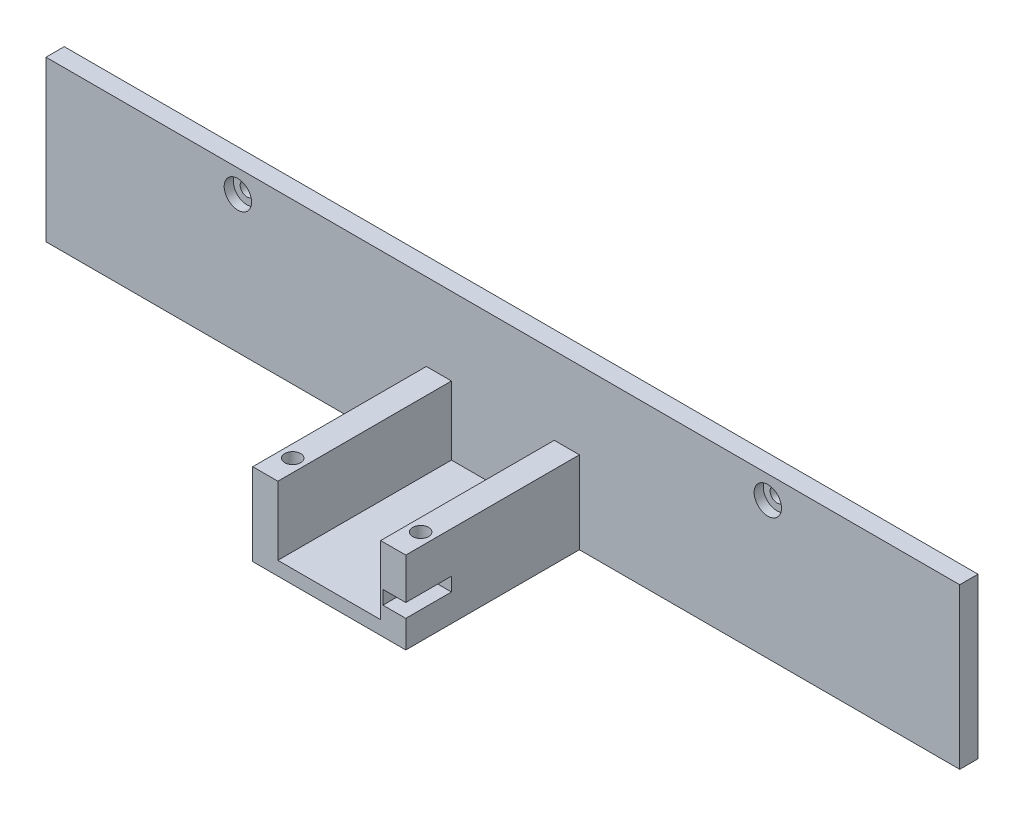
ISO-10303-21;
HEADER;
FILE_DESCRIPTION(('STEP AP214'),'2;1');
FILE_NAME('part.step','',(''),(''),'','','');
FILE_SCHEMA(('AUTOMOTIVE_DESIGN { 1 0 10303 214 1 1 1 1 }'));
ENDSEC;
DATA;
#1=APPLICATION_CONTEXT('core data for automotive mechanical design processes');
#2=APPLICATION_PROTOCOL_DEFINITION('international standard','automotive_design',2000,#1);
#3=PRODUCT_CONTEXT('',#1,'mechanical');
#4=PRODUCT('Part','Part','',(#3));
#5=PRODUCT_RELATED_PRODUCT_CATEGORY('part','',(#4));
#6=PRODUCT_DEFINITION_FORMATION('','',#4);
#7=PRODUCT_DEFINITION_CONTEXT('part definition',#1,'design');
#8=PRODUCT_DEFINITION('design','',#6,#7);
#9=PRODUCT_DEFINITION_SHAPE('','',#8);
#10=(LENGTH_UNIT() NAMED_UNIT(*) SI_UNIT(.MILLI.,.METRE.));
#11=(NAMED_UNIT(*) PLANE_ANGLE_UNIT() SI_UNIT($,.RADIAN.));
#12=(NAMED_UNIT(*) SI_UNIT($,.STERADIAN.) SOLID_ANGLE_UNIT());
#13=UNCERTAINTY_MEASURE_WITH_UNIT(LENGTH_MEASURE(1.E-05),#10,'distance_accuracy_value','');
#14=(GEOMETRIC_REPRESENTATION_CONTEXT(3) GLOBAL_UNCERTAINTY_ASSIGNED_CONTEXT((#13)) GLOBAL_UNIT_ASSIGNED_CONTEXT((#10,
#11,#12)) REPRESENTATION_CONTEXT('',''));
#15=CARTESIAN_POINT('',(0.,0.,0.));
#16=DIRECTION('',(0.,0.,1.));
#17=DIRECTION('',(1.,0.,0.));
#18=AXIS2_PLACEMENT_3D('',#15,#16,#17);
#19=CARTESIAN_POINT('',(0.,0.,4.));
#20=DIRECTION('',(0.,1.,0.));
#21=DIRECTION('',(0.,0.,1.));
#22=AXIS2_PLACEMENT_3D('',#19,#20,#21);
#23=PLANE('',#22);
#24=DIRECTION('',(1.,0.,0.));
#25=VECTOR('',#24,1.);
#26=CARTESIAN_POINT('',(0.,0.,0.));
#27=LINE('',#26,#25);
#28=CARTESIAN_POINT('',(0.,0.,0.));
#29=VERTEX_POINT('',#28);
#30=CARTESIAN_POINT('',(200.,0.,0.));
#31=VERTEX_POINT('',#30);
#32=EDGE_CURVE('E262',#29,#31,#27,.T.);
#33=ORIENTED_EDGE('',*,*,#32,.T.);
#34=DIRECTION('',(0.,0.,-1.));
#35=VECTOR('',#34,1.);
#36=CARTESIAN_POINT('',(200.,0.,4.));
#37=LINE('',#36,#35);
#38=CARTESIAN_POINT('',(200.,0.,4.));
#39=VERTEX_POINT('',#38);
#40=EDGE_CURVE('E46',#39,#31,#37,.T.);
#41=ORIENTED_EDGE('',*,*,#40,.F.);
#42=DIRECTION('',(1.,0.,0.));
#43=VECTOR('',#42,1.);
#44=CARTESIAN_POINT('',(0.,0.,4.));
#45=LINE('',#44,#43);
#46=CARTESIAN_POINT('',(116.75,0.,4.));
#47=VERTEX_POINT('',#46);
#48=EDGE_CURVE('E269',#47,#39,#45,.T.);
#49=ORIENTED_EDGE('',*,*,#48,.F.);
#50=DIRECTION('',(0.,0.,-1.));
#51=VECTOR('',#50,1.);
#52=CARTESIAN_POINT('',(116.75,0.,42.));
#53=LINE('',#52,#51);
#54=CARTESIAN_POINT('',(116.75,0.,42.));
#55=VERTEX_POINT('',#54);
#56=EDGE_CURVE('E61',#55,#47,#53,.T.);
#57=ORIENTED_EDGE('',*,*,#56,.F.);
#58=DIRECTION('',(1.,0.,0.));
#59=VECTOR('',#58,1.);
#60=CARTESIAN_POINT('',(0.,0.,42.));
#61=LINE('',#60,#59);
#62=CARTESIAN_POINT('',(83.25,0.,42.));
#63=VERTEX_POINT('',#62);
#64=EDGE_CURVE('E194',#63,#55,#61,.T.);
#65=ORIENTED_EDGE('',*,*,#64,.F.);
#66=DIRECTION('',(0.,0.,-1.));
#67=VECTOR('',#66,1.);
#68=CARTESIAN_POINT('',(83.25,0.,42.));
#69=LINE('',#68,#67);
#70=CARTESIAN_POINT('',(83.25,0.,4.));
#71=VERTEX_POINT('',#70);
#72=EDGE_CURVE('E247',#63,#71,#69,.T.);
#73=ORIENTED_EDGE('',*,*,#72,.T.);
#74=CARTESIAN_POINT('',(0.,0.,4.));
#75=VERTEX_POINT('',#74);
#76=EDGE_CURVE('E265',#75,#71,#45,.T.);
#77=ORIENTED_EDGE('',*,*,#76,.F.);
#78=DIRECTION('',(0.,0.,-1.));
#79=VECTOR('',#78,1.);
#80=CARTESIAN_POINT('',(0.,0.,4.));
#81=LINE('',#80,#79);
#82=EDGE_CURVE('E283',#75,#29,#81,.T.);
#83=ORIENTED_EDGE('',*,*,#82,.T.);
#84=EDGE_LOOP('',(#33,#41,#49,#57,#65,#73,#77,#83));
#85=FACE_BOUND('',#84,.T.);
#86=ADVANCED_FACE('F39',(#85),#23,.F.);
#87=CARTESIAN_POINT('',(200.,0.,4.));
#88=DIRECTION('',(-1.,0.,0.));
#89=DIRECTION('',(0.,0.,1.));
#90=AXIS2_PLACEMENT_3D('',#87,#88,#89);
#91=PLANE('',#90);
#92=DIRECTION('',(0.,1.,0.));
#93=VECTOR('',#92,1.);
#94=CARTESIAN_POINT('',(200.,0.,0.));
#95=LINE('',#94,#93);
#96=CARTESIAN_POINT('',(200.,35.,0.));
#97=VERTEX_POINT('',#96);
#98=EDGE_CURVE('E286',#31,#97,#95,.T.);
#99=ORIENTED_EDGE('',*,*,#98,.T.);
#100=DIRECTION('',(0.,0.,-1.));
#101=VECTOR('',#100,1.);
#102=CARTESIAN_POINT('',(200.,35.,4.));
#103=LINE('',#102,#101);
#104=CARTESIAN_POINT('',(200.,35.,4.));
#105=VERTEX_POINT('',#104);
#106=EDGE_CURVE('E298',#105,#97,#103,.T.);
#107=ORIENTED_EDGE('',*,*,#106,.F.);
#108=DIRECTION('',(0.,1.,0.));
#109=VECTOR('',#108,1.);
#110=CARTESIAN_POINT('',(200.,0.,4.));
#111=LINE('',#110,#109);
#112=EDGE_CURVE('E268',#39,#105,#111,.T.);
#113=ORIENTED_EDGE('',*,*,#112,.F.);
#114=ORIENTED_EDGE('',*,*,#40,.T.);
#115=EDGE_LOOP('',(#99,#107,#113,#114));
#116=FACE_BOUND('',#115,.T.);
#117=ADVANCED_FACE('F303',(#116),#91,.F.);
#118=CARTESIAN_POINT('',(0.,35.,4.));
#119=DIRECTION('',(0.,1.,0.));
#120=DIRECTION('',(-1.,0.,0.));
#121=AXIS2_PLACEMENT_3D('',#118,#119,#120);
#122=PLANE('',#121);
#123=DIRECTION('',(1.,0.,0.));
#124=VECTOR('',#123,1.);
#125=CARTESIAN_POINT('',(0.,35.,0.));
#126=LINE('',#125,#124);
#127=CARTESIAN_POINT('',(0.,35.,0.));
#128=VERTEX_POINT('',#127);
#129=EDGE_CURVE('E289',#128,#97,#126,.T.);
#130=ORIENTED_EDGE('',*,*,#129,.F.);
#131=DIRECTION('',(0.,0.,-1.));
#132=VECTOR('',#131,1.);
#133=CARTESIAN_POINT('',(0.,35.,4.));
#134=LINE('',#133,#132);
#135=CARTESIAN_POINT('',(0.,35.,4.));
#136=VERTEX_POINT('',#135);
#137=EDGE_CURVE('E296',#136,#128,#134,.T.);
#138=ORIENTED_EDGE('',*,*,#137,.F.);
#139=DIRECTION('',(1.,0.,0.));
#140=VECTOR('',#139,1.);
#141=CARTESIAN_POINT('',(0.,35.,4.));
#142=LINE('',#141,#140);
#143=EDGE_CURVE('E271',#136,#105,#142,.T.);
#144=ORIENTED_EDGE('',*,*,#143,.T.);
#145=ORIENTED_EDGE('',*,*,#106,.T.);
#146=EDGE_LOOP('',(#130,#138,#144,#145));
#147=FACE_BOUND('',#146,.T.);
#148=ADVANCED_FACE('F319',(#147),#122,.T.);
#149=CARTESIAN_POINT('',(42.,30.,4.));
#150=DIRECTION('',(0.,0.,-1.));
#151=DIRECTION('',(-1.,0.,0.));
#152=AXIS2_PLACEMENT_3D('',#149,#150,#151);
#153=CYLINDRICAL_SURFACE('',#152,2.99999999999999);
#154=CARTESIAN_POINT('',(42.,30.,2.));
#155=DIRECTION('',(0.,0.,1.));
#156=DIRECTION('',(1.,0.,0.));
#157=AXIS2_PLACEMENT_3D('',#154,#155,#156);
#158=CIRCLE('',#157,2.99999999999999);
#159=CARTESIAN_POINT('',(45.,30.,2.));
#160=VERTEX_POINT('',#159);
#161=EDGE_CURVE('E256',#160,#160,#158,.F.);
#162=ORIENTED_EDGE('',*,*,#161,.T.);
#163=EDGE_LOOP('',(#162));
#164=FACE_BOUND('',#163,.T.);
#165=CARTESIAN_POINT('',(42.,30.,4.));
#166=DIRECTION('',(0.,0.,1.));
#167=DIRECTION('',(1.,0.,0.));
#168=AXIS2_PLACEMENT_3D('',#165,#166,#167);
#169=CIRCLE('',#168,2.99999999999999);
#170=CARTESIAN_POINT('',(45.,30.,4.));
#171=VERTEX_POINT('',#170);
#172=EDGE_CURVE('E277',#171,#171,#169,.F.);
#173=ORIENTED_EDGE('',*,*,#172,.F.);
#174=EDGE_LOOP('',(#173));
#175=FACE_BOUND('',#174,.T.);
#176=ADVANCED_FACE('F373',(#164,#175),#153,.F.);
#177=CARTESIAN_POINT('',(0.,0.,4.));
#178=DIRECTION('',(-1.,0.,0.));
#179=DIRECTION('',(0.,0.,1.));
#180=AXIS2_PLACEMENT_3D('',#177,#178,#179);
#181=PLANE('',#180);
#182=DIRECTION('',(0.,1.,0.));
#183=VECTOR('',#182,1.);
#184=CARTESIAN_POINT('',(0.,0.,0.));
#185=LINE('',#184,#183);
#186=EDGE_CURVE('E292',#29,#128,#185,.T.);
#187=ORIENTED_EDGE('',*,*,#186,.F.);
#188=ORIENTED_EDGE('',*,*,#82,.F.);
#189=DIRECTION('',(0.,1.,0.));
#190=VECTOR('',#189,1.);
#191=CARTESIAN_POINT('',(0.,0.,4.));
#192=LINE('',#191,#190);
#193=EDGE_CURVE('E274',#75,#136,#192,.T.);
#194=ORIENTED_EDGE('',*,*,#193,.T.);
#195=ORIENTED_EDGE('',*,*,#137,.T.);
#196=EDGE_LOOP('',(#187,#188,#194,#195));
#197=FACE_BOUND('',#196,.T.);
#198=ADVANCED_FACE('F314',(#197),#181,.T.);
#199=CARTESIAN_POINT('',(158.,30.,4.));
#200=DIRECTION('',(0.,0.,-1.));
#201=DIRECTION('',(-1.,0.,0.));
#202=AXIS2_PLACEMENT_3D('',#199,#200,#201);
#203=CYLINDRICAL_SURFACE('',#202,2.99999999999999);
#204=CARTESIAN_POINT('',(158.,30.,2.));
#205=DIRECTION('',(0.,0.,1.));
#206=DIRECTION('',(1.,0.,0.));
#207=AXIS2_PLACEMENT_3D('',#204,#205,#206);
#208=CIRCLE('',#207,2.99999999999999);
#209=CARTESIAN_POINT('',(161.,30.,2.));
#210=VERTEX_POINT('',#209);
#211=EDGE_CURVE('E11',#210,#210,#208,.T.);
#212=ORIENTED_EDGE('',*,*,#211,.F.);
#213=EDGE_LOOP('',(#212));
#214=FACE_BOUND('',#213,.T.);
#215=CARTESIAN_POINT('',(158.,30.,4.));
#216=DIRECTION('',(0.,0.,1.));
#217=DIRECTION('',(1.,0.,0.));
#218=AXIS2_PLACEMENT_3D('',#215,#216,#217);
#219=CIRCLE('',#218,2.99999999999999);
#220=CARTESIAN_POINT('',(161.,30.,4.));
#221=VERTEX_POINT('',#220);
#222=EDGE_CURVE('E280',#221,#221,#219,.T.);
#223=ORIENTED_EDGE('',*,*,#222,.T.);
#224=EDGE_LOOP('',(#223));
#225=FACE_BOUND('',#224,.T.);
#226=ADVANCED_FACE('F378',(#214,#225),#203,.F.);
#227=CARTESIAN_POINT('',(0.,0.,4.));
#228=DIRECTION('',(0.,0.,1.));
#229=DIRECTION('',(1.,0.,0.));
#230=AXIS2_PLACEMENT_3D('',#227,#228,#229);
#231=PLANE('',#230);
#232=DIRECTION('',(0.,-1.,0.));
#233=VECTOR('',#232,1.);
#234=CARTESIAN_POINT('',(83.25,0.,4.));
#235=LINE('',#234,#233);
#236=CARTESIAN_POINT('',(83.25,18.,4.));
#237=VERTEX_POINT('',#236);
#238=EDGE_CURVE('E187',#237,#71,#235,.T.);
#239=ORIENTED_EDGE('',*,*,#238,.F.);
#240=DIRECTION('',(1.,0.,0.));
#241=VECTOR('',#240,1.);
#242=CARTESIAN_POINT('',(0.,18.,4.));
#243=LINE('',#242,#241);
#244=CARTESIAN_POINT('',(88.75,18.,4.));
#245=VERTEX_POINT('',#244);
#246=EDGE_CURVE('E195',#237,#245,#243,.T.);
#247=ORIENTED_EDGE('',*,*,#246,.T.);
#248=DIRECTION('',(0.,-1.,0.));
#249=VECTOR('',#248,1.);
#250=CARTESIAN_POINT('',(88.75,0.,4.));
#251=LINE('',#250,#249);
#252=CARTESIAN_POINT('',(88.75,3.,4.));
#253=VERTEX_POINT('',#252);
#254=EDGE_CURVE('E230',#245,#253,#251,.T.);
#255=ORIENTED_EDGE('',*,*,#254,.T.);
#256=DIRECTION('',(1.,0.,0.));
#257=VECTOR('',#256,1.);
#258=CARTESIAN_POINT('',(0.,2.99999999999999,4.));
#259=LINE('',#258,#257);
#260=CARTESIAN_POINT('',(111.25,3.,4.));
#261=VERTEX_POINT('',#260);
#262=EDGE_CURVE('E227',#253,#261,#259,.T.);
#263=ORIENTED_EDGE('',*,*,#262,.T.);
#264=DIRECTION('',(0.,-1.,0.));
#265=VECTOR('',#264,1.);
#266=CARTESIAN_POINT('',(111.25,0.,4.));
#267=LINE('',#266,#265);
#268=CARTESIAN_POINT('',(111.25,18.,4.));
#269=VERTEX_POINT('',#268);
#270=EDGE_CURVE('E224',#269,#261,#267,.T.);
#271=ORIENTED_EDGE('',*,*,#270,.F.);
#272=DIRECTION('',(1.,0.,0.));
#273=VECTOR('',#272,1.);
#274=CARTESIAN_POINT('',(0.,18.,4.));
#275=LINE('',#274,#273);
#276=CARTESIAN_POINT('',(116.75,18.,4.));
#277=VERTEX_POINT('',#276);
#278=EDGE_CURVE('E221',#269,#277,#275,.T.);
#279=ORIENTED_EDGE('',*,*,#278,.T.);
#280=DIRECTION('',(0.,-1.,0.));
#281=VECTOR('',#280,1.);
#282=CARTESIAN_POINT('',(116.75,0.,4.));
#283=LINE('',#282,#281);
#284=EDGE_CURVE('E219',#277,#47,#283,.T.);
#285=ORIENTED_EDGE('',*,*,#284,.T.);
#286=ORIENTED_EDGE('',*,*,#48,.T.);
#287=ORIENTED_EDGE('',*,*,#112,.T.);
#288=ORIENTED_EDGE('',*,*,#143,.F.);
#289=ORIENTED_EDGE('',*,*,#193,.F.);
#290=ORIENTED_EDGE('',*,*,#76,.T.);
#291=EDGE_LOOP('',(#239,#247,#255,#263,#271,#279,#285,#286,#287,#288,#289,#290));
#292=FACE_BOUND('',#291,.T.);
#293=ORIENTED_EDGE('',*,*,#172,.T.);
#294=EDGE_LOOP('',(#293));
#295=FACE_BOUND('',#294,.T.);
#296=ORIENTED_EDGE('',*,*,#222,.F.);
#297=EDGE_LOOP('',(#296));
#298=FACE_BOUND('',#297,.T.);
#299=ADVANCED_FACE('F322',(#292,#295,#298),#231,.T.);
#300=CARTESIAN_POINT('',(0.,0.,0.));
#301=DIRECTION('',(0.,0.,1.));
#302=DIRECTION('',(1.,0.,0.));
#303=AXIS2_PLACEMENT_3D('',#300,#301,#302);
#304=PLANE('',#303);
#305=ORIENTED_EDGE('',*,*,#32,.F.);
#306=ORIENTED_EDGE('',*,*,#186,.T.);
#307=ORIENTED_EDGE('',*,*,#129,.T.);
#308=ORIENTED_EDGE('',*,*,#98,.F.);
#309=EDGE_LOOP('',(#305,#306,#307,#308));
#310=FACE_BOUND('',#309,.T.);
#311=CARTESIAN_POINT('',(42.,30.,0.));
#312=DIRECTION('',(0.,0.,1.));
#313=DIRECTION('',(1.,0.,0.));
#314=AXIS2_PLACEMENT_3D('',#311,#312,#313);
#315=CIRCLE('',#314,1.5);
#316=CARTESIAN_POINT('',(43.5,30.,0.));
#317=VERTEX_POINT('',#316);
#318=EDGE_CURVE('E253',#317,#317,#315,.F.);
#319=ORIENTED_EDGE('',*,*,#318,.F.);
#320=EDGE_LOOP('',(#319));
#321=FACE_BOUND('',#320,.T.);
#322=CARTESIAN_POINT('',(158.,30.,0.));
#323=DIRECTION('',(0.,0.,1.));
#324=DIRECTION('',(1.,0.,0.));
#325=AXIS2_PLACEMENT_3D('',#322,#323,#324);
#326=CIRCLE('',#325,1.5);
#327=CARTESIAN_POINT('',(159.5,30.,0.));
#328=VERTEX_POINT('',#327);
#329=EDGE_CURVE('E249',#328,#328,#326,.T.);
#330=ORIENTED_EDGE('',*,*,#329,.T.);
#331=EDGE_LOOP('',(#330));
#332=FACE_BOUND('',#331,.T.);
#333=ADVANCED_FACE('F311',(#310,#321,#332),#304,.F.);
#334=CARTESIAN_POINT('',(42.,30.,2.));
#335=DIRECTION('',(0.,0.,-1.));
#336=DIRECTION('',(-1.,0.,0.));
#337=AXIS2_PLACEMENT_3D('',#334,#335,#336);
#338=CYLINDRICAL_SURFACE('',#337,1.5);
#339=CARTESIAN_POINT('',(42.,30.,2.));
#340=DIRECTION('',(0.,0.,1.));
#341=DIRECTION('',(1.,0.,0.));
#342=AXIS2_PLACEMENT_3D('',#339,#340,#341);
#343=CIRCLE('',#342,1.5);
#344=CARTESIAN_POINT('',(43.5,30.,2.));
#345=VERTEX_POINT('',#344);
#346=EDGE_CURVE('E259',#345,#345,#343,.F.);
#347=ORIENTED_EDGE('',*,*,#346,.F.);
#348=EDGE_LOOP('',(#347));
#349=FACE_BOUND('',#348,.T.);
#350=ORIENTED_EDGE('',*,*,#318,.T.);
#351=EDGE_LOOP('',(#350));
#352=FACE_BOUND('',#351,.T.);
#353=ADVANCED_FACE('F387',(#349,#352),#338,.F.);
#354=CARTESIAN_POINT('',(0.,0.,2.));
#355=DIRECTION('',(0.,0.,1.));
#356=DIRECTION('',(1.,0.,0.));
#357=AXIS2_PLACEMENT_3D('',#354,#355,#356);
#358=PLANE('',#357);
#359=ORIENTED_EDGE('',*,*,#161,.F.);
#360=EDGE_LOOP('',(#359));
#361=FACE_BOUND('',#360,.T.);
#362=ORIENTED_EDGE('',*,*,#346,.T.);
#363=EDGE_LOOP('',(#362));
#364=FACE_BOUND('',#363,.T.);
#365=ADVANCED_FACE('F392',(#361,#364),#358,.T.);
#366=CARTESIAN_POINT('',(158.,30.,2.));
#367=DIRECTION('',(0.,0.,-1.));
#368=DIRECTION('',(-1.,0.,0.));
#369=AXIS2_PLACEMENT_3D('',#366,#367,#368);
#370=CYLINDRICAL_SURFACE('',#369,1.5);
#371=CARTESIAN_POINT('',(158.,30.,2.));
#372=DIRECTION('',(0.,0.,1.));
#373=DIRECTION('',(1.,0.,0.));
#374=AXIS2_PLACEMENT_3D('',#371,#372,#373);
#375=CIRCLE('',#374,1.5);
#376=CARTESIAN_POINT('',(159.5,30.,2.));
#377=VERTEX_POINT('',#376);
#378=EDGE_CURVE('E250',#377,#377,#375,.T.);
#379=ORIENTED_EDGE('',*,*,#378,.T.);
#380=EDGE_LOOP('',(#379));
#381=FACE_BOUND('',#380,.T.);
#382=ORIENTED_EDGE('',*,*,#329,.F.);
#383=EDGE_LOOP('',(#382));
#384=FACE_BOUND('',#383,.T.);
#385=ADVANCED_FACE('F396',(#381,#384),#370,.F.);
#386=CARTESIAN_POINT('',(0.,0.,2.));
#387=DIRECTION('',(0.,0.,1.));
#388=DIRECTION('',(1.,0.,0.));
#389=AXIS2_PLACEMENT_3D('',#386,#387,#388);
#390=PLANE('',#389);
#391=ORIENTED_EDGE('',*,*,#378,.F.);
#392=EDGE_LOOP('',(#391));
#393=FACE_BOUND('',#392,.T.);
#394=ORIENTED_EDGE('',*,*,#211,.T.);
#395=EDGE_LOOP('',(#394));
#396=FACE_BOUND('',#395,.T.);
#397=ADVANCED_FACE('F364',(#393,#396),#390,.T.);
#398=CARTESIAN_POINT('',(83.25,0.,42.));
#399=DIRECTION('',(1.,0.,0.));
#400=DIRECTION('',(0.,0.,-1.));
#401=AXIS2_PLACEMENT_3D('',#398,#399,#400);
#402=PLANE('',#401);
#403=ORIENTED_EDGE('',*,*,#238,.T.);
#404=ORIENTED_EDGE('',*,*,#72,.F.);
#405=DIRECTION('',(0.,-1.,0.));
#406=VECTOR('',#405,1.);
#407=CARTESIAN_POINT('',(83.25,0.,42.));
#408=LINE('',#407,#406);
#409=CARTESIAN_POINT('',(83.25,18.,42.));
#410=VERTEX_POINT('',#409);
#411=EDGE_CURVE('E191',#410,#63,#408,.T.);
#412=ORIENTED_EDGE('',*,*,#411,.F.);
#413=DIRECTION('',(0.,0.,-1.));
#414=VECTOR('',#413,1.);
#415=CARTESIAN_POINT('',(83.25,18.,42.));
#416=LINE('',#415,#414);
#417=EDGE_CURVE('E216',#410,#237,#416,.T.);
#418=ORIENTED_EDGE('',*,*,#417,.T.);
#419=EDGE_LOOP('',(#403,#404,#412,#418));
#420=FACE_BOUND('',#419,.T.);
#421=ADVANCED_FACE('F333',(#420),#402,.F.);
#422=CARTESIAN_POINT('',(116.75,0.,42.));
#423=DIRECTION('',(1.,0.,0.));
#424=DIRECTION('',(0.,1.,0.));
#425=AXIS2_PLACEMENT_3D('',#422,#423,#424);
#426=PLANE('',#425);
#427=DIRECTION('',(0.,0.,1.));
#428=VECTOR('',#427,1.);
#429=CARTESIAN_POINT('',(116.75,9.,32.));
#430=LINE('',#429,#428);
#431=CARTESIAN_POINT('',(116.75,9.,32.));
#432=VERTEX_POINT('',#431);
#433=CARTESIAN_POINT('',(116.75,9.,42.));
#434=VERTEX_POINT('',#433);
#435=EDGE_CURVE('E188',#432,#434,#430,.T.);
#436=ORIENTED_EDGE('',*,*,#435,.F.);
#437=DIRECTION('',(0.,1.,0.));
#438=VECTOR('',#437,1.);
#439=CARTESIAN_POINT('',(116.75,6.,32.));
#440=LINE('',#439,#438);
#441=CARTESIAN_POINT('',(116.75,6.,32.));
#442=VERTEX_POINT('',#441);
#443=EDGE_CURVE('E167',#442,#432,#440,.T.);
#444=ORIENTED_EDGE('',*,*,#443,.F.);
#445=DIRECTION('',(0.,0.,1.));
#446=VECTOR('',#445,1.);
#447=CARTESIAN_POINT('',(116.75,6.,32.));
#448=LINE('',#447,#446);
#449=CARTESIAN_POINT('',(116.75,6.,42.));
#450=VERTEX_POINT('',#449);
#451=EDGE_CURVE('E158',#442,#450,#448,.T.);
#452=ORIENTED_EDGE('',*,*,#451,.T.);
#453=DIRECTION('',(0.,-1.,0.));
#454=VECTOR('',#453,1.);
#455=CARTESIAN_POINT('',(116.75,0.,42.));
#456=LINE('',#455,#454);
#457=EDGE_CURVE('E198',#450,#55,#456,.T.);
#458=ORIENTED_EDGE('',*,*,#457,.T.);
#459=ORIENTED_EDGE('',*,*,#56,.T.);
#460=ORIENTED_EDGE('',*,*,#284,.F.);
#461=DIRECTION('',(0.,0.,-1.));
#462=VECTOR('',#461,1.);
#463=CARTESIAN_POINT('',(116.75,18.,42.));
#464=LINE('',#463,#462);
#465=CARTESIAN_POINT('',(116.75,18.,42.));
#466=VERTEX_POINT('',#465);
#467=EDGE_CURVE('E244',#466,#277,#464,.T.);
#468=ORIENTED_EDGE('',*,*,#467,.F.);
#469=EDGE_CURVE('E199',#466,#434,#456,.T.);
#470=ORIENTED_EDGE('',*,*,#469,.T.);
#471=EDGE_LOOP('',(#436,#444,#452,#458,#459,#460,#468,#470));
#472=FACE_BOUND('',#471,.T.);
#473=ADVANCED_FACE('F355',(#472),#426,.T.);
#474=CARTESIAN_POINT('',(0.,18.,42.));
#475=DIRECTION('',(0.,1.,0.));
#476=DIRECTION('',(-1.,0.,0.));
#477=AXIS2_PLACEMENT_3D('',#474,#475,#476);
#478=PLANE('',#477);
#479=CARTESIAN_POINT('',(114.,18.,36.));
#480=DIRECTION('',(0.,1.,0.));
#481=DIRECTION('',(1.,0.,0.));
#482=AXIS2_PLACEMENT_3D('',#479,#480,#481);
#483=CIRCLE('',#482,1.75);
#484=CARTESIAN_POINT('',(115.75,18.,36.));
#485=VERTEX_POINT('',#484);
#486=EDGE_CURVE('E723',#485,#485,#483,.T.);
#487=ORIENTED_EDGE('',*,*,#486,.F.);
#488=EDGE_LOOP('',(#487));
#489=FACE_BOUND('',#488,.T.);
#490=ORIENTED_EDGE('',*,*,#278,.F.);
#491=DIRECTION('',(0.,0.,-1.));
#492=VECTOR('',#491,1.);
#493=CARTESIAN_POINT('',(111.25,18.,42.));
#494=LINE('',#493,#492);
#495=CARTESIAN_POINT('',(111.25,18.,42.));
#496=VERTEX_POINT('',#495);
#497=EDGE_CURVE('E242',#496,#269,#494,.T.);
#498=ORIENTED_EDGE('',*,*,#497,.F.);
#499=DIRECTION('',(1.,0.,0.));
#500=VECTOR('',#499,1.);
#501=CARTESIAN_POINT('',(0.,18.,42.));
#502=LINE('',#501,#500);
#503=EDGE_CURVE('E202',#496,#466,#502,.T.);
#504=ORIENTED_EDGE('',*,*,#503,.T.);
#505=ORIENTED_EDGE('',*,*,#467,.T.);
#506=EDGE_LOOP('',(#490,#498,#504,#505));
#507=FACE_BOUND('',#506,.T.);
#508=ADVANCED_FACE('F352',(#489,#507),#478,.T.);
#509=CARTESIAN_POINT('',(111.25,0.,42.));
#510=DIRECTION('',(1.,0.,0.));
#511=DIRECTION('',(0.,0.,-1.));
#512=AXIS2_PLACEMENT_3D('',#509,#510,#511);
#513=PLANE('',#512);
#514=ORIENTED_EDGE('',*,*,#270,.T.);
#515=DIRECTION('',(0.,0.,-1.));
#516=VECTOR('',#515,1.);
#517=CARTESIAN_POINT('',(111.25,3.,42.));
#518=LINE('',#517,#516);
#519=CARTESIAN_POINT('',(111.25,3.,42.));
#520=VERTEX_POINT('',#519);
#521=EDGE_CURVE('E240',#520,#261,#518,.T.);
#522=ORIENTED_EDGE('',*,*,#521,.F.);
#523=DIRECTION('',(0.,-1.,0.));
#524=VECTOR('',#523,1.);
#525=CARTESIAN_POINT('',(111.25,0.,42.));
#526=LINE('',#525,#524);
#527=EDGE_CURVE('E205',#496,#520,#526,.T.);
#528=ORIENTED_EDGE('',*,*,#527,.F.);
#529=ORIENTED_EDGE('',*,*,#497,.T.);
#530=EDGE_LOOP('',(#514,#522,#528,#529));
#531=FACE_BOUND('',#530,.T.);
#532=ADVANCED_FACE('F348',(#531),#513,.F.);
#533=CARTESIAN_POINT('',(0.,2.99999999999999,42.));
#534=DIRECTION('',(0.,1.,0.));
#535=DIRECTION('',(-1.,0.,0.));
#536=AXIS2_PLACEMENT_3D('',#533,#534,#535);
#537=PLANE('',#536);
#538=ORIENTED_EDGE('',*,*,#262,.F.);
#539=DIRECTION('',(0.,0.,-1.));
#540=VECTOR('',#539,1.);
#541=CARTESIAN_POINT('',(88.75,3.,42.));
#542=LINE('',#541,#540);
#543=CARTESIAN_POINT('',(88.75,3.,42.));
#544=VERTEX_POINT('',#543);
#545=EDGE_CURVE('E238',#544,#253,#542,.T.);
#546=ORIENTED_EDGE('',*,*,#545,.F.);
#547=DIRECTION('',(1.,0.,0.));
#548=VECTOR('',#547,1.);
#549=CARTESIAN_POINT('',(0.,2.99999999999999,42.));
#550=LINE('',#549,#548);
#551=EDGE_CURVE('E207',#544,#520,#550,.T.);
#552=ORIENTED_EDGE('',*,*,#551,.T.);
#553=ORIENTED_EDGE('',*,*,#521,.T.);
#554=EDGE_LOOP('',(#538,#546,#552,#553));
#555=FACE_BOUND('',#554,.T.);
#556=ADVANCED_FACE('F343',(#555),#537,.T.);
#557=CARTESIAN_POINT('',(88.75,0.,42.));
#558=DIRECTION('',(1.,0.,0.));
#559=DIRECTION('',(0.,0.,-1.));
#560=AXIS2_PLACEMENT_3D('',#557,#558,#559);
#561=PLANE('',#560);
#562=ORIENTED_EDGE('',*,*,#254,.F.);
#563=DIRECTION('',(0.,0.,-1.));
#564=VECTOR('',#563,1.);
#565=CARTESIAN_POINT('',(88.75,18.,42.));
#566=LINE('',#565,#564);
#567=CARTESIAN_POINT('',(88.75,18.,42.));
#568=VERTEX_POINT('',#567);
#569=EDGE_CURVE('E236',#568,#245,#566,.T.);
#570=ORIENTED_EDGE('',*,*,#569,.F.);
#571=DIRECTION('',(0.,-1.,0.));
#572=VECTOR('',#571,1.);
#573=CARTESIAN_POINT('',(88.75,0.,42.));
#574=LINE('',#573,#572);
#575=EDGE_CURVE('E210',#568,#544,#574,.T.);
#576=ORIENTED_EDGE('',*,*,#575,.T.);
#577=ORIENTED_EDGE('',*,*,#545,.T.);
#578=EDGE_LOOP('',(#562,#570,#576,#577));
#579=FACE_BOUND('',#578,.T.);
#580=ADVANCED_FACE('F339',(#579),#561,.T.);
#581=CARTESIAN_POINT('',(0.,18.,42.));
#582=DIRECTION('',(0.,1.,0.));
#583=DIRECTION('',(-1.,0.,0.));
#584=AXIS2_PLACEMENT_3D('',#581,#582,#583);
#585=PLANE('',#584);
#586=CARTESIAN_POINT('',(86.,18.,36.));
#587=DIRECTION('',(0.,1.,0.));
#588=DIRECTION('',(-1.,0.,0.));
#589=AXIS2_PLACEMENT_3D('',#586,#587,#588);
#590=CIRCLE('',#589,1.75);
#591=CARTESIAN_POINT('',(84.25,18.,36.));
#592=VERTEX_POINT('',#591);
#593=EDGE_CURVE('E725',#592,#592,#590,.T.);
#594=ORIENTED_EDGE('',*,*,#593,.F.);
#595=EDGE_LOOP('',(#594));
#596=FACE_BOUND('',#595,.T.);
#597=ORIENTED_EDGE('',*,*,#246,.F.);
#598=ORIENTED_EDGE('',*,*,#417,.F.);
#599=DIRECTION('',(1.,0.,0.));
#600=VECTOR('',#599,1.);
#601=CARTESIAN_POINT('',(0.,18.,42.));
#602=LINE('',#601,#600);
#603=EDGE_CURVE('E213',#410,#568,#602,.T.);
#604=ORIENTED_EDGE('',*,*,#603,.T.);
#605=ORIENTED_EDGE('',*,*,#569,.T.);
#606=EDGE_LOOP('',(#597,#598,#604,#605));
#607=FACE_BOUND('',#606,.T.);
#608=ADVANCED_FACE('F337',(#596,#607),#585,.T.);
#609=CARTESIAN_POINT('',(0.,0.,42.));
#610=DIRECTION('',(0.,0.,1.));
#611=DIRECTION('',(1.,0.,0.));
#612=AXIS2_PLACEMENT_3D('',#609,#610,#611);
#613=PLANE('',#612);
#614=DIRECTION('',(-1.,0.,0.));
#615=VECTOR('',#614,1.);
#616=CARTESIAN_POINT('',(111.75,9.,42.));
#617=LINE('',#616,#615);
#618=CARTESIAN_POINT('',(111.75,9.,42.));
#619=VERTEX_POINT('',#618);
#620=EDGE_CURVE('E171',#434,#619,#617,.T.);
#621=ORIENTED_EDGE('',*,*,#620,.F.);
#622=ORIENTED_EDGE('',*,*,#469,.F.);
#623=ORIENTED_EDGE('',*,*,#503,.F.);
#624=ORIENTED_EDGE('',*,*,#527,.T.);
#625=ORIENTED_EDGE('',*,*,#551,.F.);
#626=ORIENTED_EDGE('',*,*,#575,.F.);
#627=ORIENTED_EDGE('',*,*,#603,.F.);
#628=ORIENTED_EDGE('',*,*,#411,.T.);
#629=ORIENTED_EDGE('',*,*,#64,.T.);
#630=ORIENTED_EDGE('',*,*,#457,.F.);
#631=DIRECTION('',(1.,0.,0.));
#632=VECTOR('',#631,1.);
#633=CARTESIAN_POINT('',(111.75,6.,42.));
#634=LINE('',#633,#632);
#635=CARTESIAN_POINT('',(111.75,6.,42.));
#636=VERTEX_POINT('',#635);
#637=EDGE_CURVE('E174',#636,#450,#634,.T.);
#638=ORIENTED_EDGE('',*,*,#637,.F.);
#639=DIRECTION('',(0.,-1.,0.));
#640=VECTOR('',#639,1.);
#641=CARTESIAN_POINT('',(111.75,6.,42.));
#642=LINE('',#641,#640);
#643=EDGE_CURVE('E53',#619,#636,#642,.T.);
#644=ORIENTED_EDGE('',*,*,#643,.F.);
#645=EDGE_LOOP('',(#621,#622,#623,#624,#625,#626,#627,#628,#629,#630,#638,#644));
#646=FACE_BOUND('',#645,.T.);
#647=ADVANCED_FACE('F330',(#646),#613,.T.);
#648=CARTESIAN_POINT('',(111.75,6.,32.));
#649=DIRECTION('',(-1.,0.,0.));
#650=DIRECTION('',(0.,-1.,0.));
#651=AXIS2_PLACEMENT_3D('',#648,#649,#650);
#652=PLANE('',#651);
#653=ORIENTED_EDGE('',*,*,#643,.T.);
#654=DIRECTION('',(0.,0.,1.));
#655=VECTOR('',#654,1.);
#656=CARTESIAN_POINT('',(111.75,6.,32.));
#657=LINE('',#656,#655);
#658=CARTESIAN_POINT('',(111.75,6.,32.));
#659=VERTEX_POINT('',#658);
#660=EDGE_CURVE('E150',#659,#636,#657,.T.);
#661=ORIENTED_EDGE('',*,*,#660,.F.);
#662=DIRECTION('',(0.,-1.,0.));
#663=VECTOR('',#662,1.);
#664=CARTESIAN_POINT('',(111.75,6.,32.));
#665=LINE('',#664,#663);
#666=CARTESIAN_POINT('',(111.75,9.,32.));
#667=VERTEX_POINT('',#666);
#668=EDGE_CURVE('E154',#667,#659,#665,.T.);
#669=ORIENTED_EDGE('',*,*,#668,.F.);
#670=DIRECTION('',(0.,0.,1.));
#671=VECTOR('',#670,1.);
#672=CARTESIAN_POINT('',(111.75,9.,32.));
#673=LINE('',#672,#671);
#674=EDGE_CURVE('E185',#667,#619,#673,.T.);
#675=ORIENTED_EDGE('',*,*,#674,.T.);
#676=EDGE_LOOP('',(#653,#661,#669,#675));
#677=FACE_BOUND('',#676,.T.);
#678=ADVANCED_FACE('F152',(#677),#652,.F.);
#679=CARTESIAN_POINT('',(111.75,9.,32.));
#680=DIRECTION('',(0.,1.,0.));
#681=DIRECTION('',(0.,0.,1.));
#682=AXIS2_PLACEMENT_3D('',#679,#680,#681);
#683=PLANE('',#682);
#684=ORIENTED_EDGE('',*,*,#620,.T.);
#685=ORIENTED_EDGE('',*,*,#674,.F.);
#686=DIRECTION('',(-1.,0.,0.));
#687=VECTOR('',#686,1.);
#688=CARTESIAN_POINT('',(111.75,9.,32.));
#689=LINE('',#688,#687);
#690=EDGE_CURVE('E159',#432,#667,#689,.T.);
#691=ORIENTED_EDGE('',*,*,#690,.F.);
#692=ORIENTED_EDGE('',*,*,#435,.T.);
#693=EDGE_LOOP('',(#684,#685,#691,#692));
#694=FACE_BOUND('',#693,.T.);
#695=ADVANCED_FACE('F478',(#694),#683,.F.);
#696=CARTESIAN_POINT('',(111.75,6.,32.));
#697=DIRECTION('',(0.,-1.,0.));
#698=DIRECTION('',(0.,0.,-1.));
#699=AXIS2_PLACEMENT_3D('',#696,#697,#698);
#700=PLANE('',#699);
#701=ORIENTED_EDGE('',*,*,#637,.T.);
#702=ORIENTED_EDGE('',*,*,#451,.F.);
#703=DIRECTION('',(1.,0.,0.));
#704=VECTOR('',#703,1.);
#705=CARTESIAN_POINT('',(111.75,6.,32.));
#706=LINE('',#705,#704);
#707=EDGE_CURVE('E162',#659,#442,#706,.T.);
#708=ORIENTED_EDGE('',*,*,#707,.F.);
#709=ORIENTED_EDGE('',*,*,#660,.T.);
#710=EDGE_LOOP('',(#701,#702,#708,#709));
#711=FACE_BOUND('',#710,.T.);
#712=ADVANCED_FACE('F163',(#711),#700,.F.);
#713=CARTESIAN_POINT('',(0.,0.,32.));
#714=DIRECTION('',(0.,0.,-1.));
#715=DIRECTION('',(-1.,0.,0.));
#716=AXIS2_PLACEMENT_3D('',#713,#714,#715);
#717=PLANE('',#716);
#718=ORIENTED_EDGE('',*,*,#668,.T.);
#719=ORIENTED_EDGE('',*,*,#707,.T.);
#720=ORIENTED_EDGE('',*,*,#443,.T.);
#721=ORIENTED_EDGE('',*,*,#690,.T.);
#722=EDGE_LOOP('',(#718,#719,#720,#721));
#723=FACE_BOUND('',#722,.T.);
#724=ADVANCED_FACE('F169',(#723),#717,.F.);
#725=CARTESIAN_POINT('',(86.,12.,36.));
#726=DIRECTION('',(0.,1.,0.));
#727=DIRECTION('',(-1.,0.,0.));
#728=AXIS2_PLACEMENT_3D('',#725,#726,#727);
#729=CYLINDRICAL_SURFACE('',#728,1.75);
#730=CARTESIAN_POINT('',(86.,12.,36.));
#731=DIRECTION('',(0.,1.,0.));
#732=DIRECTION('',(-1.,0.,0.));
#733=AXIS2_PLACEMENT_3D('',#730,#731,#732);
#734=CIRCLE('',#733,1.75);
#735=CARTESIAN_POINT('',(84.25,12.,36.));
#736=VERTEX_POINT('',#735);
#737=EDGE_CURVE('E183',#736,#736,#734,.T.);
#738=ORIENTED_EDGE('',*,*,#737,.F.);
#739=EDGE_LOOP('',(#738));
#740=FACE_BOUND('',#739,.T.);
#741=ORIENTED_EDGE('',*,*,#593,.T.);
#742=EDGE_LOOP('',(#741));
#743=FACE_BOUND('',#742,.T.);
#744=ADVANCED_FACE('F507',(#740,#743),#729,.F.);
#745=CARTESIAN_POINT('',(86.,12.,36.));
#746=DIRECTION('',(0.,1.,0.));
#747=DIRECTION('',(-1.,0.,0.));
#748=AXIS2_PLACEMENT_3D('',#745,#746,#747);
#749=PLANE('',#748);
#750=ORIENTED_EDGE('',*,*,#737,.T.);
#751=EDGE_LOOP('',(#750));
#752=FACE_BOUND('',#751,.T.);
#753=ADVANCED_FACE('F532',(#752),#749,.T.);
#754=CARTESIAN_POINT('',(114.,12.,36.));
#755=DIRECTION('',(0.,1.,0.));
#756=DIRECTION('',(-1.,0.,0.));
#757=AXIS2_PLACEMENT_3D('',#754,#755,#756);
#758=CYLINDRICAL_SURFACE('',#757,1.75);
#759=CARTESIAN_POINT('',(114.,12.,36.));
#760=DIRECTION('',(0.,1.,0.));
#761=DIRECTION('',(1.,0.,0.));
#762=AXIS2_PLACEMENT_3D('',#759,#760,#761);
#763=CIRCLE('',#762,1.75);
#764=CARTESIAN_POINT('',(115.75,12.,36.));
#765=VERTEX_POINT('',#764);
#766=EDGE_CURVE('E177',#765,#765,#763,.T.);
#767=ORIENTED_EDGE('',*,*,#766,.F.);
#768=EDGE_LOOP('',(#767));
#769=FACE_BOUND('',#768,.T.);
#770=ORIENTED_EDGE('',*,*,#486,.T.);
#771=EDGE_LOOP('',(#770));
#772=FACE_BOUND('',#771,.T.);
#773=ADVANCED_FACE('F543',(#769,#772),#758,.F.);
#774=CARTESIAN_POINT('',(114.,12.,36.));
#775=DIRECTION('',(0.,-1.,0.));
#776=DIRECTION('',(1.,0.,0.));
#777=AXIS2_PLACEMENT_3D('',#774,#775,#776);
#778=PLANE('',#777);
#779=ORIENTED_EDGE('',*,*,#766,.T.);
#780=EDGE_LOOP('',(#779));
#781=FACE_BOUND('',#780,.T.);
#782=ADVANCED_FACE('F554',(#781),#778,.F.);
#783=CLOSED_SHELL('',(#86,#117,#148,#176,#198,#226,#299,#333,#353,#365,#385,#397,#421,#473,#508,
#532,#556,#580,#608,#647,#678,#695,#712,#724,#744,#753,#773,#782));
#784=MANIFOLD_SOLID_BREP('B2',#783);
#785=ADVANCED_BREP_SHAPE_REPRESENTATION('',(#18,#784),#14);
#786=SHAPE_DEFINITION_REPRESENTATION(#9,#785);
ENDSEC;
END-ISO-10303-21;
